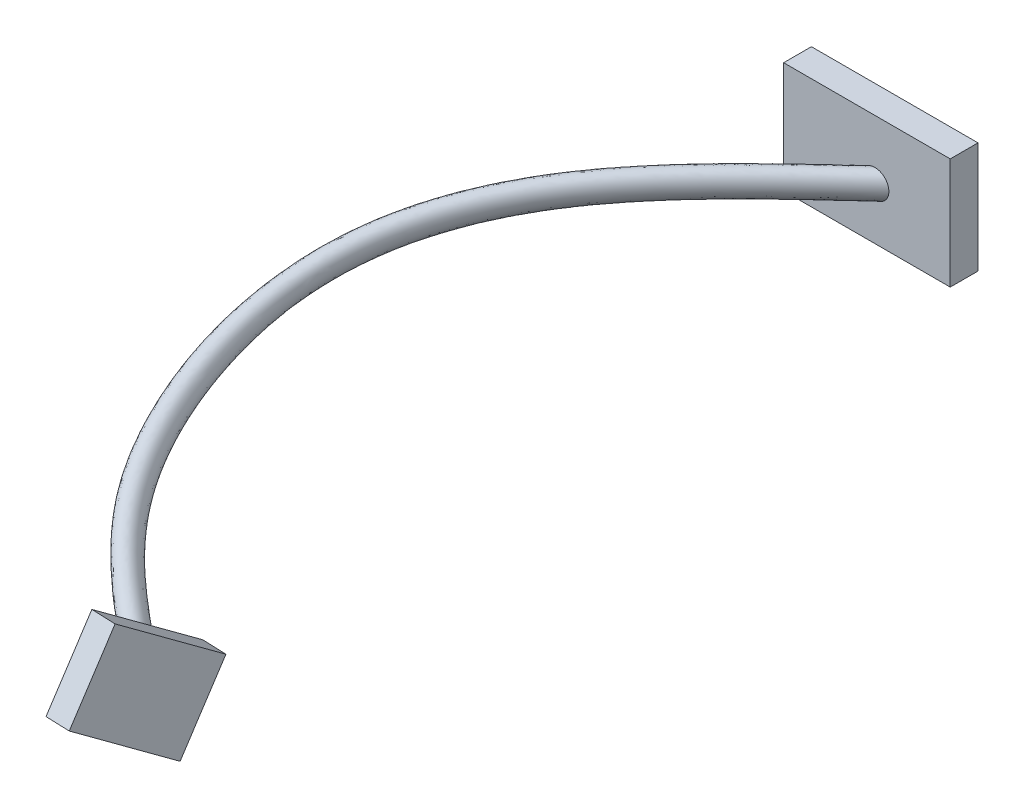
ISO-10303-21;
HEADER;
FILE_DESCRIPTION(('STEP AP214'),'2;1');
FILE_NAME('part.step','',(''),(''),'','','');
FILE_SCHEMA(('AUTOMOTIVE_DESIGN { 1 0 10303 214 1 1 1 1 }'));
ENDSEC;
DATA;
#1=APPLICATION_CONTEXT('core data for automotive mechanical design processes');
#2=APPLICATION_PROTOCOL_DEFINITION('international standard','automotive_design',2000,#1);
#3=PRODUCT_CONTEXT('',#1,'mechanical');
#4=PRODUCT('Part','Part','',(#3));
#5=PRODUCT_RELATED_PRODUCT_CATEGORY('part','',(#4));
#6=PRODUCT_DEFINITION_FORMATION('','',#4);
#7=PRODUCT_DEFINITION_CONTEXT('part definition',#1,'design');
#8=PRODUCT_DEFINITION('design','',#6,#7);
#9=PRODUCT_DEFINITION_SHAPE('','',#8);
#10=(LENGTH_UNIT() NAMED_UNIT(*) SI_UNIT(.MILLI.,.METRE.));
#11=(NAMED_UNIT(*) PLANE_ANGLE_UNIT() SI_UNIT($,.RADIAN.));
#12=(NAMED_UNIT(*) SI_UNIT($,.STERADIAN.) SOLID_ANGLE_UNIT());
#13=UNCERTAINTY_MEASURE_WITH_UNIT(LENGTH_MEASURE(1.E-05),#10,'distance_accuracy_value','');
#14=(GEOMETRIC_REPRESENTATION_CONTEXT(3) GLOBAL_UNCERTAINTY_ASSIGNED_CONTEXT((#13)) GLOBAL_UNIT_ASSIGNED_CONTEXT((#10,
#11,#12)) REPRESENTATION_CONTEXT('',''));
#15=CARTESIAN_POINT('',(0.,0.,0.));
#16=DIRECTION('',(0.,0.,1.));
#17=DIRECTION('',(1.,0.,0.));
#18=AXIS2_PLACEMENT_3D('',#15,#16,#17);
#19=CARTESIAN_POINT('',(-68.4657754496669,-154.454318806586,6.35));
#20=DIRECTION('',(-1.,0.,0.));
#21=DIRECTION('',(0.,0.,1.));
#22=AXIS2_PLACEMENT_3D('',#19,#20,#21);
#23=PLANE('',#22);
#24=DIRECTION('',(0.,1.,0.));
#25=VECTOR('',#24,1.);
#26=CARTESIAN_POINT('',(-68.4657754496669,-154.454318806586,0.));
#27=LINE('',#26,#25);
#28=CARTESIAN_POINT('',(-68.4657754496669,-154.454318806586,0.));
#29=VERTEX_POINT('',#28);
#30=CARTESIAN_POINT('',(-68.4657754496669,-129.054318806586,0.));
#31=VERTEX_POINT('',#30);
#32=EDGE_CURVE('E135',#29,#31,#27,.T.);
#33=ORIENTED_EDGE('',*,*,#32,.T.);
#34=DIRECTION('',(0.,0.,-1.));
#35=VECTOR('',#34,1.);
#36=CARTESIAN_POINT('',(-68.4657754496669,-129.054318806586,6.35));
#37=LINE('',#36,#35);
#38=CARTESIAN_POINT('',(-68.4657754496669,-129.054318806586,6.35));
#39=VERTEX_POINT('',#38);
#40=EDGE_CURVE('E39',#39,#31,#37,.T.);
#41=ORIENTED_EDGE('',*,*,#40,.F.);
#42=DIRECTION('',(0.,1.,0.));
#43=VECTOR('',#42,1.);
#44=CARTESIAN_POINT('',(-68.4657754496669,-154.454318806586,6.35));
#45=LINE('',#44,#43);
#46=CARTESIAN_POINT('',(-68.4657754496669,-154.454318806586,6.35));
#47=VERTEX_POINT('',#46);
#48=EDGE_CURVE('E141',#47,#39,#45,.T.);
#49=ORIENTED_EDGE('',*,*,#48,.F.);
#50=DIRECTION('',(0.,0.,-1.));
#51=VECTOR('',#50,1.);
#52=CARTESIAN_POINT('',(-68.4657754496669,-154.454318806586,6.35));
#53=LINE('',#52,#51);
#54=EDGE_CURVE('E147',#47,#29,#53,.T.);
#55=ORIENTED_EDGE('',*,*,#54,.T.);
#56=EDGE_LOOP('',(#33,#41,#49,#55));
#57=FACE_BOUND('',#56,.T.);
#58=ADVANCED_FACE('F32',(#57),#23,.F.);
#59=CARTESIAN_POINT('',(-68.4657754496669,-129.054318806586,6.35));
#60=DIRECTION('',(0.,-1.,0.));
#61=DIRECTION('',(0.,0.,-1.));
#62=AXIS2_PLACEMENT_3D('',#59,#60,#61);
#63=PLANE('',#62);
#64=DIRECTION('',(-1.,0.,0.));
#65=VECTOR('',#64,1.);
#66=CARTESIAN_POINT('',(-68.4657754496669,-129.054318806586,0.));
#67=LINE('',#66,#65);
#68=CARTESIAN_POINT('',(-106.565775449667,-129.054318806586,0.));
#69=VERTEX_POINT('',#68);
#70=EDGE_CURVE('E150',#31,#69,#67,.T.);
#71=ORIENTED_EDGE('',*,*,#70,.T.);
#72=DIRECTION('',(0.,0.,-1.));
#73=VECTOR('',#72,1.);
#74=CARTESIAN_POINT('',(-106.565775449667,-129.054318806586,6.35));
#75=LINE('',#74,#73);
#76=CARTESIAN_POINT('',(-106.565775449667,-129.054318806586,6.35));
#77=VERTEX_POINT('',#76);
#78=EDGE_CURVE('E158',#77,#69,#75,.T.);
#79=ORIENTED_EDGE('',*,*,#78,.F.);
#80=DIRECTION('',(-1.,0.,0.));
#81=VECTOR('',#80,1.);
#82=CARTESIAN_POINT('',(-68.4657754496669,-129.054318806586,6.35));
#83=LINE('',#82,#81);
#84=EDGE_CURVE('E84',#39,#77,#83,.T.);
#85=ORIENTED_EDGE('',*,*,#84,.F.);
#86=ORIENTED_EDGE('',*,*,#40,.T.);
#87=EDGE_LOOP('',(#71,#79,#85,#86));
#88=FACE_BOUND('',#87,.T.);
#89=ADVANCED_FACE('F161',(#88),#63,.F.);
#90=CARTESIAN_POINT('',(-106.565775449667,-154.454318806586,6.35));
#91=DIRECTION('',(1.,0.,0.));
#92=DIRECTION('',(0.,0.,-1.));
#93=AXIS2_PLACEMENT_3D('',#90,#91,#92);
#94=PLANE('',#93);
#95=DIRECTION('',(0.,-1.,0.));
#96=VECTOR('',#95,1.);
#97=CARTESIAN_POINT('',(-106.565775449667,-154.454318806586,0.));
#98=LINE('',#97,#96);
#99=CARTESIAN_POINT('',(-106.565775449667,-154.454318806586,0.));
#100=VERTEX_POINT('',#99);
#101=EDGE_CURVE('E152',#69,#100,#98,.T.);
#102=ORIENTED_EDGE('',*,*,#101,.T.);
#103=DIRECTION('',(0.,0.,-1.));
#104=VECTOR('',#103,1.);
#105=CARTESIAN_POINT('',(-106.565775449667,-154.454318806586,6.35));
#106=LINE('',#105,#104);
#107=CARTESIAN_POINT('',(-106.565775449667,-154.454318806586,6.35));
#108=VERTEX_POINT('',#107);
#109=EDGE_CURVE('E156',#108,#100,#106,.T.);
#110=ORIENTED_EDGE('',*,*,#109,.F.);
#111=DIRECTION('',(0.,-1.,0.));
#112=VECTOR('',#111,1.);
#113=CARTESIAN_POINT('',(-106.565775449667,-154.454318806586,6.35));
#114=LINE('',#113,#112);
#115=EDGE_CURVE('E144',#77,#108,#114,.T.);
#116=ORIENTED_EDGE('',*,*,#115,.F.);
#117=ORIENTED_EDGE('',*,*,#78,.T.);
#118=EDGE_LOOP('',(#102,#110,#116,#117));
#119=FACE_BOUND('',#118,.T.);
#120=ADVANCED_FACE('F170',(#119),#94,.F.);
#121=CARTESIAN_POINT('',(-68.4657754496669,-154.454318806586,6.35));
#122=DIRECTION('',(0.,1.,0.));
#123=DIRECTION('',(0.,0.,1.));
#124=AXIS2_PLACEMENT_3D('',#121,#122,#123);
#125=PLANE('',#124);
#126=DIRECTION('',(1.,0.,0.));
#127=VECTOR('',#126,1.);
#128=CARTESIAN_POINT('',(-68.4657754496669,-154.454318806586,0.));
#129=LINE('',#128,#127);
#130=EDGE_CURVE('E76',#100,#29,#129,.T.);
#131=ORIENTED_EDGE('',*,*,#130,.T.);
#132=ORIENTED_EDGE('',*,*,#54,.F.);
#133=DIRECTION('',(1.,0.,0.));
#134=VECTOR('',#133,1.);
#135=CARTESIAN_POINT('',(-68.4657754496669,-154.454318806586,6.35));
#136=LINE('',#135,#134);
#137=EDGE_CURVE('E55',#108,#47,#136,.T.);
#138=ORIENTED_EDGE('',*,*,#137,.F.);
#139=ORIENTED_EDGE('',*,*,#109,.T.);
#140=EDGE_LOOP('',(#131,#132,#138,#139));
#141=FACE_BOUND('',#140,.T.);
#142=ADVANCED_FACE('F172',(#141),#125,.F.);
#143=CARTESIAN_POINT('',(-68.4657754496669,-129.054318806586,6.35));
#144=DIRECTION('',(0.,0.,1.));
#145=DIRECTION('',(1.,0.,0.));
#146=AXIS2_PLACEMENT_3D('',#143,#144,#145);
#147=PLANE('',#146);
#148=CARTESIAN_POINT('',(-85.6754099293084,-142.53738832798,6.35));
#149=DIRECTION('',(0.,0.,1.));
#150=DIRECTION('',(1.,0.,0.));
#151=AXIS2_PLACEMENT_3D('',#148,#149,#150);
#152=CIRCLE('',#151,3.175);
#153=CARTESIAN_POINT('',(-82.5004099293084,-142.53738832798,6.35));
#154=VERTEX_POINT('',#153);
#155=EDGE_CURVE('E11',#154,#154,#152,.T.);
#156=ORIENTED_EDGE('',*,*,#155,.F.);
#157=EDGE_LOOP('',(#156));
#158=FACE_BOUND('',#157,.T.);
#159=ORIENTED_EDGE('',*,*,#48,.T.);
#160=ORIENTED_EDGE('',*,*,#84,.T.);
#161=ORIENTED_EDGE('',*,*,#115,.T.);
#162=ORIENTED_EDGE('',*,*,#137,.T.);
#163=EDGE_LOOP('',(#159,#160,#161,#162));
#164=FACE_BOUND('',#163,.T.);
#165=ADVANCED_FACE('F173',(#158,#164),#147,.T.);
#166=CARTESIAN_POINT('',(-68.4657754496669,-129.054318806586,0.));
#167=DIRECTION('',(0.,0.,1.));
#168=DIRECTION('',(1.,0.,0.));
#169=AXIS2_PLACEMENT_3D('',#166,#167,#168);
#170=PLANE('',#169);
#171=ORIENTED_EDGE('',*,*,#32,.F.);
#172=ORIENTED_EDGE('',*,*,#130,.F.);
#173=ORIENTED_EDGE('',*,*,#101,.F.);
#174=ORIENTED_EDGE('',*,*,#70,.F.);
#175=EDGE_LOOP('',(#171,#172,#173,#174));
#176=FACE_BOUND('',#175,.T.);
#177=ADVANCED_FACE('F166',(#176),#170,.F.);
#178=CARTESIAN_POINT('',(-82.5004099293084,-142.53738832798,6.35));
#179=CARTESIAN_POINT('',(-88.8441470466746,-141.555377438445,14.0126886811923));
#180=CARTESIAN_POINT('',(-101.311637312563,-139.625409191059,29.072344334604));
#181=CARTESIAN_POINT('',(-118.040149643009,-138.308978281053,52.4889000092153));
#182=CARTESIAN_POINT('',(-128.289707851239,-140.214488762461,73.7464960352977));
#183=CARTESIAN_POINT('',(-132.561764425517,-144.511595343903,91.388041892849));
#184=CARTESIAN_POINT('',(-133.74839967008,-148.741678540229,105.022174372271));
#185=CARTESIAN_POINT('',(-132.52678482878,-154.106487060735,118.283321270521));
#186=CARTESIAN_POINT('',(-128.576063369138,-159.937573285697,130.537917191753));
#187=CARTESIAN_POINT('',(-121.016978645511,-165.743775528074,140.647610590043));
#188=CARTESIAN_POINT('',(-114.043388604373,-169.301268451278,145.884991795875));
#189=CARTESIAN_POINT('',(-110.521889910564,-171.097718573581,148.529745927752));
#190=CARTESIAN_POINT('',(-82.5004099293084,-136.18738832798,6.35));
#191=CARTESIAN_POINT('',(-88.863625055301,-135.205440613941,14.0413198905002));
#192=CARTESIAN_POINT('',(-101.369395892792,-133.27559652679,29.1572451081677));
#193=CARTESIAN_POINT('',(-118.374730614706,-131.974351214857,53.0932254422729));
#194=CARTESIAN_POINT('',(-128.968637133529,-134.057063486845,75.2340872546523));
#195=CARTESIAN_POINT('',(-133.207505455752,-138.630731501885,93.7633312676788));
#196=CARTESIAN_POINT('',(-135.502974461045,-143.29031534994,107.849032150314));
#197=CARTESIAN_POINT('',(-134.667974411176,-149.212179029817,121.751067294216));
#198=CARTESIAN_POINT('',(-130.810268899612,-155.734866213626,134.806661990197));
#199=CARTESIAN_POINT('',(-122.371128904281,-162.129196951889,145.715071844971));
#200=CARTESIAN_POINT('',(-115.275876314499,-165.711324548992,150.983350881718));
#201=CARTESIAN_POINT('',(-111.692940899632,-167.520214601294,153.643707690346));
#202=CARTESIAN_POINT('',(-88.8504099293084,-136.18738832798,6.35));
#203=CARTESIAN_POINT('',(-95.2137814192155,-135.2237380216,14.0868514735906));
#204=CARTESIAN_POINT('',(-107.71985956225,-133.329854244225,29.2922609429645));
#205=CARTESIAN_POINT('',(-124.689489467488,-132.358773801241,54.0220495236468));
#206=CARTESIAN_POINT('',(-134.926840487882,-135.131901676178,77.295307240704));
#207=CARTESIAN_POINT('',(-138.56403887436,-140.420355004176,96.765942920326));
#208=CARTESIAN_POINT('',(-140.028934695173,-146.449327355057,111.120509708143));
#209=CARTESIAN_POINT('',(-138.151919803144,-153.233283703952,125.300232777629));
#210=CARTESIAN_POINT('',(-132.916164161461,-160.543911144372,138.554913184536));
#211=CARTESIAN_POINT('',(-122.559884529436,-167.326107371052,149.43131469359));
#212=CARTESIAN_POINT('',(-115.301674007519,-170.908239946393,154.654563009042));
#213=CARTESIAN_POINT('',(-111.636448675725,-172.717132512589,157.292180364206));
#214=CARTESIAN_POINT('',(-88.8504099293084,-142.53738832798,6.35));
#215=CARTESIAN_POINT('',(-95.1943034105891,-141.573674846104,14.0582202642827));
#216=CARTESIAN_POINT('',(-107.662100982021,-139.679666908494,29.2073601694008));
#217=CARTESIAN_POINT('',(-124.354908495792,-138.693400867437,53.4177240905892));
#218=CARTESIAN_POINT('',(-134.247911205591,-141.289326951794,75.8077160213495));
#219=CARTESIAN_POINT('',(-137.918297844125,-146.301218846194,94.3906535454962));
#220=CARTESIAN_POINT('',(-138.274359904208,-151.900690545346,108.2936519301));
#221=CARTESIAN_POINT('',(-136.010730220748,-158.12759173487,121.832486753935));
#222=CARTESIAN_POINT('',(-130.681958630986,-164.746618216443,134.286168386092));
#223=CARTESIAN_POINT('',(-121.205734270666,-170.940685947237,144.363853438662));
#224=CARTESIAN_POINT('',(-114.069186297392,-174.498183848679,149.556203923199));
#225=CARTESIAN_POINT('',(-110.465397686657,-176.294636484876,152.178218601612));
#226=CARTESIAN_POINT('',(-88.8504099293084,-148.88738832798,6.35));
#227=CARTESIAN_POINT('',(-95.1748254019627,-147.923611670607,14.0295890549747));
#228=CARTESIAN_POINT('',(-107.604342401792,-146.029479572764,29.1224593958371));
#229=CARTESIAN_POINT('',(-124.020327524095,-145.028027933634,52.8133986575317));
#230=CARTESIAN_POINT('',(-133.568981923301,-147.446752227409,74.320124801995));
#231=CARTESIAN_POINT('',(-137.272556813889,-152.182082688213,92.0153641706665));
#232=CARTESIAN_POINT('',(-136.519785113243,-157.352053735635,105.466794152057));
#233=CARTESIAN_POINT('',(-133.869540638352,-163.021899765788,118.36474073024));
#234=CARTESIAN_POINT('',(-128.447753100512,-168.949325288515,130.017423587649));
#235=CARTESIAN_POINT('',(-119.851584011896,-174.555264523421,139.296392183733));
#236=CARTESIAN_POINT('',(-112.836698587266,-178.088127750966,144.457844837356));
#237=CARTESIAN_POINT('',(-109.294346697589,-179.872140457163,147.064256839018));
#238=CARTESIAN_POINT('',(-82.5004099293084,-148.88738832798,6.35));
#239=CARTESIAN_POINT('',(-88.8246690380482,-147.905314262949,13.9840574718844));
#240=CARTESIAN_POINT('',(-101.253878732334,-145.975221855328,28.9874435610403));
#241=CARTESIAN_POINT('',(-117.705568671312,-144.643605347249,51.8845745761577));
#242=CARTESIAN_POINT('',(-127.610778568948,-146.371914038076,72.2589048159431));
#243=CARTESIAN_POINT('',(-131.916023395282,-150.392459185921,89.0127525180192));
#244=CARTESIAN_POINT('',(-131.993824879114,-154.193041730518,102.195316594228));
#245=CARTESIAN_POINT('',(-130.385595246384,-159.000795091653,114.815575246826));
#246=CARTESIAN_POINT('',(-126.341857838663,-164.140280357769,126.26917239331));
#247=CARTESIAN_POINT('',(-119.662828386741,-169.358354104258,135.580149335114));
#248=CARTESIAN_POINT('',(-112.810900894246,-172.891212353564,140.786632710032));
#249=CARTESIAN_POINT('',(-109.350838921496,-174.675222545869,143.415784165158));
#250=CARTESIAN_POINT('',(-82.5004099293084,-142.53738832798,6.35));
#251=CARTESIAN_POINT('',(-88.8441470466746,-141.555377438445,14.0126886811923));
#252=CARTESIAN_POINT('',(-101.311637312563,-139.625409191059,29.072344334604));
#253=CARTESIAN_POINT('',(-118.040149643009,-138.308978281053,52.4889000092153));
#254=CARTESIAN_POINT('',(-128.289707851239,-140.214488762461,73.7464960352977));
#255=CARTESIAN_POINT('',(-132.561764425517,-144.511595343903,91.388041892849));
#256=CARTESIAN_POINT('',(-133.74839967008,-148.741678540229,105.022174372271));
#257=CARTESIAN_POINT('',(-132.52678482878,-154.106487060735,118.283321270521));
#258=CARTESIAN_POINT('',(-128.576063369138,-159.937573285697,130.537917191753));
#259=CARTESIAN_POINT('',(-121.016978645511,-165.743775528074,140.647610590043));
#260=CARTESIAN_POINT('',(-114.043388604373,-169.301268451278,145.884991795875));
#261=CARTESIAN_POINT('',(-110.521889910564,-171.097718573581,148.529745927752));
#262=(BOUNDED_SURFACE() B_SPLINE_SURFACE(3,3,((#178,#179,#180,#181,#182,#183,#184,#185,#186,
#187,#188,#189),(#190,#191,#192,#193,#194,#195,#196,#197,#198,#199,#200,#201),(#202,#203,#204,
#205,#206,#207,#208,#209,#210,#211,#212,#213),(#214,#215,#216,#217,#218,#219,#220,#221,#222,
#223,#224,#225),(#226,#227,#228,#229,#230,#231,#232,#233,#234,#235,#236,#237),(#238,#239,#240,
#241,#242,#243,#244,#245,#246,#247,#248,#249),(#250,#251,#252,#253,#254,#255,#256,#257,#258,
#259,#260,#261)),.UNSPECIFIED.,.T.,.F.,.F.) B_SPLINE_SURFACE_WITH_KNOTS((4,3,4),(4,1,1,1,1,1,1,
1,1,4),(0.,0.5,1.),(0.,0.173299149197998,0.340588743786076,0.501817301476003,0.583812869016871,
0.668703876128585,0.753679276871403,0.836441997242163,0.917407061545629,1.),
.UNSPECIFIED.) GEOMETRIC_REPRESENTATION_ITEM() RATIONAL_B_SPLINE_SURFACE(((1.,1.,1.,1.,1.,1.,1.,
1.,1.,1.,1.,1.),(0.333333333333333,0.333333333333333,0.333333333333333,0.333333333333333,
0.333333333333333,0.333333333333333,0.333333333333333,0.333333333333333,0.333333333333333,
0.333333333333333,0.333333333333333,0.333333333333333),(0.333333333333333,0.333333333333333,
0.333333333333333,0.333333333333333,0.333333333333333,0.333333333333333,0.333333333333333,
0.333333333333333,0.333333333333333,0.333333333333333,0.333333333333333,0.333333333333333),(1.,
1.,1.,1.,1.,1.,1.,1.,1.,1.,1.,1.),(0.333333333333333,0.333333333333333,0.333333333333333,
0.333333333333333,0.333333333333333,0.333333333333333,0.333333333333333,0.333333333333333,
0.333333333333333,0.333333333333333,0.333333333333333,0.333333333333333),(0.333333333333333,
0.333333333333333,0.333333333333333,0.333333333333333,0.333333333333333,0.333333333333333,
0.333333333333333,0.333333333333333,0.333333333333333,0.333333333333333,0.333333333333333,
0.333333333333333),(1.,1.,1.,1.,1.,1.,1.,1.,1.,1.,1.,1.))) REPRESENTATION_ITEM('') SURFACE());
#263=CARTESIAN_POINT('',(-110.49364379861,-173.696177529229,150.353982264682));
#264=DIRECTION('',(-0.982807736752811,-0.113124102083307,-0.145917408511332));
#265=DIRECTION('',(-0.146860123303856,0.,0.989157269691315));
#266=AXIS2_PLACEMENT_3D('',#263,#264,#265);
#267=CIRCLE('',#266,3.17499999999999);
#268=CARTESIAN_POINT('',(-110.530717137765,-171.071037526736,148.568515789266));
#269=VERTEX_POINT('',#268);
#270=EDGE_CURVE('E132',#269,#269,#267,.T.);
#271=ORIENTED_EDGE('',*,*,#155,.T.);
#272=EDGE_LOOP('',(#271));
#273=FACE_BOUND('',#272,.T.);
#274=ORIENTED_EDGE('',*,*,#270,.T.);
#275=EDGE_LOOP('',(#274));
#276=FACE_BOUND('',#275,.T.);
#277=ADVANCED_FACE('F181',(#273,#276),#262,.T.);
#278=CARTESIAN_POINT('',(-101.832050716215,-177.702104339852,138.638356021311));
#279=DIRECTION('',(-0.1842623363698,0.550979722881617,0.813921824482449));
#280=DIRECTION('',(0.,-0.828101321574276,0.560578452321294));
#281=AXIS2_PLACEMENT_3D('',#278,#279,#280);
#282=PLANE('',#281);
#283=DIRECTION('',(-0.0116766422554057,0.826815748822639,-0.562351645791579));
#284=VECTOR('',#283,1.);
#285=CARTESIAN_POINT('',(-108.072879844595,-178.420442388081,137.711780477264));
#286=LINE('',#285,#284);
#287=CARTESIAN_POINT('',(-107.85043980963,-194.171282403152,148.424579329594));
#288=VERTEX_POINT('',#287);
#289=CARTESIAN_POINT('',(-108.072879844595,-178.420442388081,137.711780477264));
#290=VERTEX_POINT('',#289);
#291=EDGE_CURVE('E131',#288,#290,#286,.T.);
#292=ORIENTED_EDGE('',*,*,#291,.T.);
#293=DIRECTION('',(-0.982807736752811,-0.113124102083308,-0.145917408511333));
#294=VECTOR('',#293,1.);
#295=CARTESIAN_POINT('',(-101.832050716215,-177.702104339852,138.638356021311));
#296=LINE('',#295,#294);
#297=CARTESIAN_POINT('',(-101.832050716215,-177.702104339852,138.638356021311));
#298=VERTEX_POINT('',#297);
#299=EDGE_CURVE('E111',#298,#290,#296,.T.);
#300=ORIENTED_EDGE('',*,*,#299,.F.);
#301=DIRECTION('',(-0.0116766422554057,0.826815748822639,-0.562351645791579));
#302=VECTOR('',#301,1.);
#303=CARTESIAN_POINT('',(-101.832050716215,-177.702104339852,138.638356021311));
#304=LINE('',#303,#302);
#305=CARTESIAN_POINT('',(-101.609610681249,-193.452944354923,149.351154873641));
#306=VERTEX_POINT('',#305);
#307=EDGE_CURVE('E118',#306,#298,#304,.T.);
#308=ORIENTED_EDGE('',*,*,#307,.F.);
#309=DIRECTION('',(-0.982807736752811,-0.113124102083308,-0.145917408511333));
#310=VECTOR('',#309,1.);
#311=CARTESIAN_POINT('',(-101.609610681249,-193.452944354923,149.351154873641));
#312=LINE('',#311,#310);
#313=EDGE_CURVE('E294',#306,#288,#312,.T.);
#314=ORIENTED_EDGE('',*,*,#313,.T.);
#315=EDGE_LOOP('',(#292,#300,#308,#314));
#316=FACE_BOUND('',#315,.T.);
#317=ADVANCED_FACE('F129',(#316),#282,.F.);
#318=CARTESIAN_POINT('',(-101.832050716215,-177.702104339852,138.638356021311));
#319=DIRECTION('',(0.0116766422554063,-0.826815748822639,0.56235164579158));
#320=DIRECTION('',(0.,-0.562389986341439,-0.826872120259763));
#321=AXIS2_PLACEMENT_3D('',#318,#319,#320);
#322=PLANE('',#321);
#323=DIRECTION('',(-0.1842623363698,0.550979722881618,0.813921824482449));
#324=VECTOR('',#323,1.);
#325=CARTESIAN_POINT('',(-108.072879844595,-178.420442388081,137.711780477264));
#326=LINE('',#325,#324);
#327=EDGE_CURVE('E46',#290,#269,#326,.T.);
#328=ORIENTED_EDGE('',*,*,#327,.T.);
#329=CARTESIAN_POINT('',(-112.753143188388,-164.425557426888,158.385394819118));
#330=VERTEX_POINT('',#329);
#331=EDGE_CURVE('E285',#269,#330,#326,.T.);
#332=ORIENTED_EDGE('',*,*,#331,.T.);
#333=DIRECTION('',(-0.982807736752811,-0.113124102083308,-0.145917408511333));
#334=VECTOR('',#333,1.);
#335=CARTESIAN_POINT('',(-106.512314060008,-163.707219378659,159.311970363165));
#336=LINE('',#335,#334);
#337=CARTESIAN_POINT('',(-106.512314060008,-163.707219378659,159.311970363165));
#338=VERTEX_POINT('',#337);
#339=EDGE_CURVE('E114',#338,#330,#336,.T.);
#340=ORIENTED_EDGE('',*,*,#339,.F.);
#341=DIRECTION('',(-0.1842623363698,0.550979722881618,0.813921824482449));
#342=VECTOR('',#341,1.);
#343=CARTESIAN_POINT('',(-101.832050716215,-177.702104339852,138.638356021311));
#344=LINE('',#343,#342);
#345=EDGE_CURVE('E107',#298,#338,#344,.T.);
#346=ORIENTED_EDGE('',*,*,#345,.F.);
#347=ORIENTED_EDGE('',*,*,#299,.T.);
#348=EDGE_LOOP('',(#328,#332,#340,#346,#347));
#349=FACE_BOUND('',#348,.T.);
#350=ADVANCED_FACE('F109',(#349),#322,.F.);
#351=CARTESIAN_POINT('',(-106.512314060008,-163.707219378659,159.311970363165));
#352=DIRECTION('',(0.1842623363698,-0.550979722881617,-0.813921824482449));
#353=DIRECTION('',(0.,0.828101321574276,-0.560578452321294));
#354=AXIS2_PLACEMENT_3D('',#351,#352,#353);
#355=PLANE('',#354);
#356=DIRECTION('',(0.0116766422554057,-0.826815748822639,0.562351645791579));
#357=VECTOR('',#356,1.);
#358=CARTESIAN_POINT('',(-112.753143188388,-164.425557426888,158.385394819118));
#359=LINE('',#358,#357);
#360=CARTESIAN_POINT('',(-112.530703153422,-180.176397441959,169.098193671448));
#361=VERTEX_POINT('',#360);
#362=EDGE_CURVE('E287',#330,#361,#359,.T.);
#363=ORIENTED_EDGE('',*,*,#362,.T.);
#364=DIRECTION('',(-0.982807736752811,-0.113124102083308,-0.145917408511333));
#365=VECTOR('',#364,1.);
#366=CARTESIAN_POINT('',(-106.289874025042,-179.45805939373,170.024769215495));
#367=LINE('',#366,#365);
#368=CARTESIAN_POINT('',(-106.289874025042,-179.45805939373,170.024769215495));
#369=VERTEX_POINT('',#368);
#370=EDGE_CURVE('E137',#369,#361,#367,.T.);
#371=ORIENTED_EDGE('',*,*,#370,.F.);
#372=DIRECTION('',(0.0116766422554057,-0.826815748822639,0.562351645791579));
#373=VECTOR('',#372,1.);
#374=CARTESIAN_POINT('',(-106.512314060008,-163.707219378659,159.311970363165));
#375=LINE('',#374,#373);
#376=EDGE_CURVE('E117',#338,#369,#375,.T.);
#377=ORIENTED_EDGE('',*,*,#376,.F.);
#378=ORIENTED_EDGE('',*,*,#339,.T.);
#379=EDGE_LOOP('',(#363,#371,#377,#378));
#380=FACE_BOUND('',#379,.T.);
#381=ADVANCED_FACE('F235',(#380),#355,.F.);
#382=CARTESIAN_POINT('',(-101.609610681249,-193.452944354923,149.351154873641));
#383=DIRECTION('',(-0.0116766422554066,0.82681574882264,-0.562351645791578));
#384=DIRECTION('',(0.,0.562389986341438,0.826872120259764));
#385=AXIS2_PLACEMENT_3D('',#382,#383,#384);
#386=PLANE('',#385);
#387=DIRECTION('',(0.1842623363698,-0.550979722881617,-0.81392182448245));
#388=VECTOR('',#387,1.);
#389=CARTESIAN_POINT('',(-107.85043980963,-194.171282403152,148.424579329594));
#390=LINE('',#389,#388);
#391=EDGE_CURVE('E127',#361,#288,#390,.T.);
#392=ORIENTED_EDGE('',*,*,#391,.T.);
#393=ORIENTED_EDGE('',*,*,#313,.F.);
#394=DIRECTION('',(0.1842623363698,-0.550979722881617,-0.81392182448245));
#395=VECTOR('',#394,1.);
#396=CARTESIAN_POINT('',(-101.609610681249,-193.452944354923,149.351154873641));
#397=LINE('',#396,#395);
#398=EDGE_CURVE('E123',#369,#306,#397,.T.);
#399=ORIENTED_EDGE('',*,*,#398,.F.);
#400=ORIENTED_EDGE('',*,*,#370,.T.);
#401=EDGE_LOOP('',(#392,#393,#399,#400));
#402=FACE_BOUND('',#401,.T.);
#403=ADVANCED_FACE('F244',(#402),#386,.F.);
#404=CARTESIAN_POINT('',(-101.609610681249,-193.452944354923,149.351154873641));
#405=DIRECTION('',(-0.982807736752811,-0.113124102083307,-0.145917408511334));
#406=DIRECTION('',(-0.146860123303858,0.,0.989157269691314));
#407=AXIS2_PLACEMENT_3D('',#404,#405,#406);
#408=PLANE('',#407);
#409=ORIENTED_EDGE('',*,*,#307,.T.);
#410=ORIENTED_EDGE('',*,*,#345,.T.);
#411=ORIENTED_EDGE('',*,*,#376,.T.);
#412=ORIENTED_EDGE('',*,*,#398,.T.);
#413=EDGE_LOOP('',(#409,#410,#411,#412));
#414=FACE_BOUND('',#413,.T.);
#415=ADVANCED_FACE('F121',(#414),#408,.F.);
#416=CARTESIAN_POINT('',(-107.85043980963,-194.171282403152,148.424579329594));
#417=DIRECTION('',(-0.982807736752811,-0.113124102083307,-0.145917408511334));
#418=DIRECTION('',(-0.146860123303858,0.,0.989157269691314));
#419=AXIS2_PLACEMENT_3D('',#416,#417,#418);
#420=PLANE('',#419);
#421=ORIENTED_EDGE('',*,*,#331,.F.);
#422=ORIENTED_EDGE('',*,*,#270,.F.);
#423=ORIENTED_EDGE('',*,*,#327,.F.);
#424=ORIENTED_EDGE('',*,*,#291,.F.);
#425=ORIENTED_EDGE('',*,*,#391,.F.);
#426=ORIENTED_EDGE('',*,*,#362,.F.);
#427=EDGE_LOOP('',(#421,#422,#423,#424,#425,#426));
#428=FACE_BOUND('',#427,.T.);
#429=ADVANCED_FACE('F263',(#428),#420,.T.);
#430=CLOSED_SHELL('',(#58,#89,#120,#142,#165,#177,#277,#317,#350,#381,#403,#415,#429));
#431=MANIFOLD_SOLID_BREP('B2',#430);
#432=ADVANCED_BREP_SHAPE_REPRESENTATION('',(#18,#431),#14);
#433=SHAPE_DEFINITION_REPRESENTATION(#9,#432);
ENDSEC;
END-ISO-10303-21;
